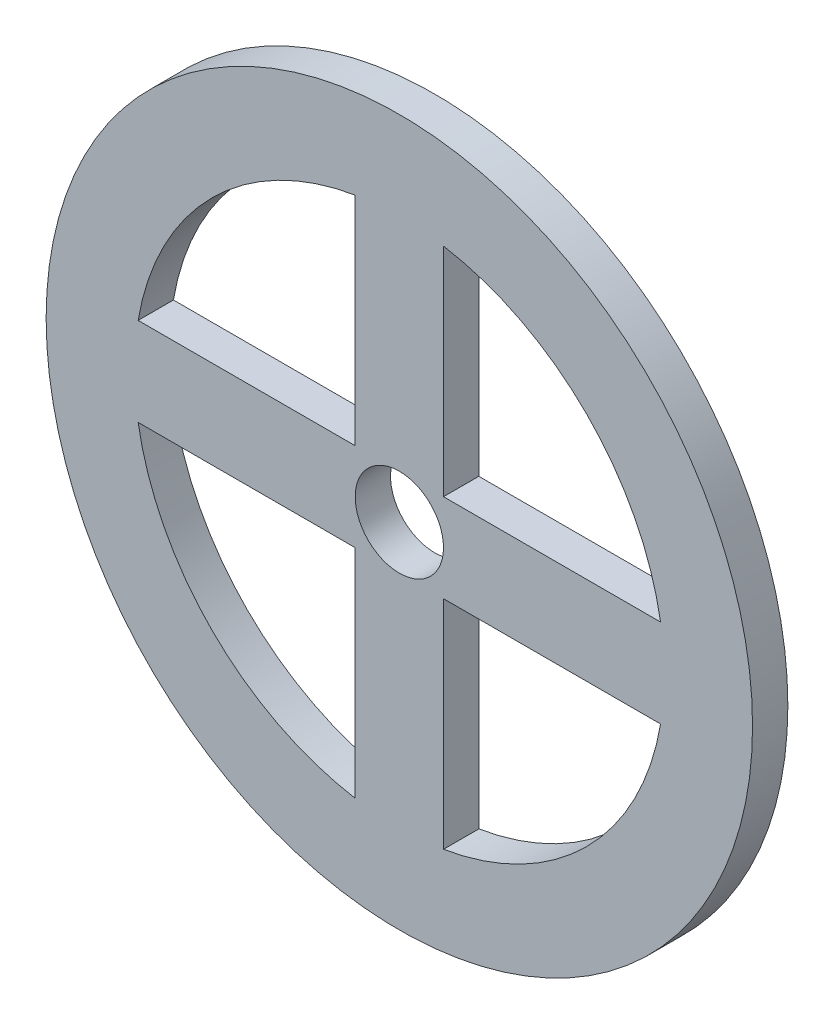
ISO-10303-21;
HEADER;
FILE_DESCRIPTION(('STEP AP214'),'2;1');
FILE_NAME('part.step','',(''),(''),'','','');
FILE_SCHEMA(('AUTOMOTIVE_DESIGN { 1 0 10303 214 1 1 1 1 }'));
ENDSEC;
DATA;
#1=APPLICATION_CONTEXT('core data for automotive mechanical design processes');
#2=APPLICATION_PROTOCOL_DEFINITION('international standard','automotive_design',2000,#1);
#3=PRODUCT_CONTEXT('',#1,'mechanical');
#4=PRODUCT('Part','Part','',(#3));
#5=PRODUCT_RELATED_PRODUCT_CATEGORY('part','',(#4));
#6=PRODUCT_DEFINITION_FORMATION('','',#4);
#7=PRODUCT_DEFINITION_CONTEXT('part definition',#1,'design');
#8=PRODUCT_DEFINITION('design','',#6,#7);
#9=PRODUCT_DEFINITION_SHAPE('','',#8);
#10=(LENGTH_UNIT() NAMED_UNIT(*) SI_UNIT(.MILLI.,.METRE.));
#11=(NAMED_UNIT(*) PLANE_ANGLE_UNIT() SI_UNIT($,.RADIAN.));
#12=(NAMED_UNIT(*) SI_UNIT($,.STERADIAN.) SOLID_ANGLE_UNIT());
#13=UNCERTAINTY_MEASURE_WITH_UNIT(LENGTH_MEASURE(1.E-05),#10,'distance_accuracy_value','');
#14=(GEOMETRIC_REPRESENTATION_CONTEXT(3) GLOBAL_UNCERTAINTY_ASSIGNED_CONTEXT((#13)) GLOBAL_UNIT_ASSIGNED_CONTEXT((#10,
#11,#12)) REPRESENTATION_CONTEXT('',''));
#15=CARTESIAN_POINT('',(0.,0.,0.));
#16=DIRECTION('',(0.,0.,1.));
#17=DIRECTION('',(1.,0.,0.));
#18=AXIS2_PLACEMENT_3D('',#15,#16,#17);
#19=CARTESIAN_POINT('',(0.,0.,2.54));
#20=DIRECTION('',(0.,0.,1.));
#21=DIRECTION('',(1.,0.,0.));
#22=AXIS2_PLACEMENT_3D('',#19,#20,#21);
#23=PLANE('',#22);
#24=CARTESIAN_POINT('',(0.,0.,2.54));
#25=DIRECTION('',(0.,0.,1.));
#26=DIRECTION('',(1.,0.,0.));
#27=AXIS2_PLACEMENT_3D('',#24,#25,#26);
#28=CIRCLE('',#27,19.05);
#29=CARTESIAN_POINT('',(3.175,-18.7835533113413,2.54));
#30=VERTEX_POINT('',#29);
#31=CARTESIAN_POINT('',(18.7835533113413,-3.175,2.54));
#32=VERTEX_POINT('',#31);
#33=EDGE_CURVE('E138',#30,#32,#28,.T.);
#34=ORIENTED_EDGE('',*,*,#33,.F.);
#35=DIRECTION('',(0.,-1.,0.));
#36=VECTOR('',#35,1.);
#37=CARTESIAN_POINT('',(3.175,0.,2.54));
#38=LINE('',#37,#36);
#39=CARTESIAN_POINT('',(3.175,-3.175,2.54));
#40=VERTEX_POINT('',#39);
#41=EDGE_CURVE('E153',#40,#30,#38,.T.);
#42=ORIENTED_EDGE('',*,*,#41,.F.);
#43=DIRECTION('',(1.,0.,0.));
#44=VECTOR('',#43,1.);
#45=CARTESIAN_POINT('',(0.,-3.175,2.54));
#46=LINE('',#45,#44);
#47=EDGE_CURVE('E165',#40,#32,#46,.T.);
#48=ORIENTED_EDGE('',*,*,#47,.T.);
#49=EDGE_LOOP('',(#34,#42,#48));
#50=FACE_BOUND('',#49,.T.);
#51=CARTESIAN_POINT('',(0.,0.,2.54));
#52=DIRECTION('',(0.,0.,1.));
#53=DIRECTION('',(1.,0.,0.));
#54=AXIS2_PLACEMENT_3D('',#51,#52,#53);
#55=CIRCLE('',#54,19.05);
#56=CARTESIAN_POINT('',(-18.7835533113413,-3.175,2.54));
#57=VERTEX_POINT('',#56);
#58=CARTESIAN_POINT('',(-3.175,-18.7835533113413,2.54));
#59=VERTEX_POINT('',#58);
#60=EDGE_CURVE('E237',#57,#59,#55,.T.);
#61=ORIENTED_EDGE('',*,*,#60,.F.);
#62=DIRECTION('',(-1.,0.,0.));
#63=VECTOR('',#62,1.);
#64=CARTESIAN_POINT('',(0.,-3.175,2.54));
#65=LINE('',#64,#63);
#66=CARTESIAN_POINT('',(-3.175,-3.175,2.54));
#67=VERTEX_POINT('',#66);
#68=EDGE_CURVE('E234',#67,#57,#65,.T.);
#69=ORIENTED_EDGE('',*,*,#68,.F.);
#70=DIRECTION('',(0.,-1.,0.));
#71=VECTOR('',#70,1.);
#72=CARTESIAN_POINT('',(-3.175,0.,2.54));
#73=LINE('',#72,#71);
#74=EDGE_CURVE('E242',#67,#59,#73,.T.);
#75=ORIENTED_EDGE('',*,*,#74,.T.);
#76=EDGE_LOOP('',(#61,#69,#75));
#77=FACE_BOUND('',#76,.T.);
#78=CARTESIAN_POINT('',(0.,0.,2.54));
#79=DIRECTION('',(0.,0.,1.));
#80=DIRECTION('',(1.,0.,0.));
#81=AXIS2_PLACEMENT_3D('',#78,#79,#80);
#82=CIRCLE('',#81,25.4);
#83=CARTESIAN_POINT('',(25.4,0.,2.54));
#84=VERTEX_POINT('',#83);
#85=EDGE_CURVE('E11',#84,#84,#82,.T.);
#86=ORIENTED_EDGE('',*,*,#85,.T.);
#87=EDGE_LOOP('',(#86));
#88=FACE_BOUND('',#87,.T.);
#89=CARTESIAN_POINT('',(0.,0.,2.54));
#90=DIRECTION('',(0.,0.,1.));
#91=DIRECTION('',(1.,0.,0.));
#92=AXIS2_PLACEMENT_3D('',#89,#90,#91);
#93=CIRCLE('',#92,3.175);
#94=CARTESIAN_POINT('',(3.175,0.,2.54));
#95=VERTEX_POINT('',#94);
#96=EDGE_CURVE('E333',#95,#95,#93,.T.);
#97=ORIENTED_EDGE('',*,*,#96,.F.);
#98=EDGE_LOOP('',(#97));
#99=FACE_BOUND('',#98,.T.);
#100=CARTESIAN_POINT('',(0.,0.,2.54));
#101=DIRECTION('',(0.,0.,1.));
#102=DIRECTION('',(1.,0.,0.));
#103=AXIS2_PLACEMENT_3D('',#100,#101,#102);
#104=CIRCLE('',#103,19.05);
#105=CARTESIAN_POINT('',(18.7835533113413,3.175,2.54));
#106=VERTEX_POINT('',#105);
#107=CARTESIAN_POINT('',(3.175,18.7835533113413,2.54));
#108=VERTEX_POINT('',#107);
#109=EDGE_CURVE('E229',#106,#108,#104,.T.);
#110=ORIENTED_EDGE('',*,*,#109,.F.);
#111=DIRECTION('',(1.,0.,0.));
#112=VECTOR('',#111,1.);
#113=CARTESIAN_POINT('',(0.,3.175,2.54));
#114=LINE('',#113,#112);
#115=CARTESIAN_POINT('',(3.175,3.175,2.54));
#116=VERTEX_POINT('',#115);
#117=EDGE_CURVE('E219',#116,#106,#114,.T.);
#118=ORIENTED_EDGE('',*,*,#117,.F.);
#119=DIRECTION('',(0.,1.,0.));
#120=VECTOR('',#119,1.);
#121=CARTESIAN_POINT('',(3.175,0.,2.54));
#122=LINE('',#121,#120);
#123=EDGE_CURVE('E214',#116,#108,#122,.T.);
#124=ORIENTED_EDGE('',*,*,#123,.T.);
#125=EDGE_LOOP('',(#110,#118,#124));
#126=FACE_BOUND('',#125,.T.);
#127=CARTESIAN_POINT('',(0.,0.,2.54));
#128=DIRECTION('',(0.,0.,1.));
#129=DIRECTION('',(1.,0.,0.));
#130=AXIS2_PLACEMENT_3D('',#127,#128,#129);
#131=CIRCLE('',#130,19.05);
#132=CARTESIAN_POINT('',(-3.175,18.7835533113413,2.54));
#133=VERTEX_POINT('',#132);
#134=CARTESIAN_POINT('',(-18.7835533113413,3.175,2.54));
#135=VERTEX_POINT('',#134);
#136=EDGE_CURVE('E200',#133,#135,#131,.T.);
#137=ORIENTED_EDGE('',*,*,#136,.F.);
#138=DIRECTION('',(0.,1.,0.));
#139=VECTOR('',#138,1.);
#140=CARTESIAN_POINT('',(-3.175,0.,2.54));
#141=LINE('',#140,#139);
#142=CARTESIAN_POINT('',(-3.175,3.175,2.54));
#143=VERTEX_POINT('',#142);
#144=EDGE_CURVE('E188',#143,#133,#141,.T.);
#145=ORIENTED_EDGE('',*,*,#144,.F.);
#146=DIRECTION('',(-1.,0.,0.));
#147=VECTOR('',#146,1.);
#148=CARTESIAN_POINT('',(0.,3.175,2.54));
#149=LINE('',#148,#147);
#150=EDGE_CURVE('E183',#143,#135,#149,.T.);
#151=ORIENTED_EDGE('',*,*,#150,.T.);
#152=EDGE_LOOP('',(#137,#145,#151));
#153=FACE_BOUND('',#152,.T.);
#154=ADVANCED_FACE('F39',(#50,#77,#88,#99,#126,#153),#23,.T.);
#155=CARTESIAN_POINT('',(0.,0.,0.));
#156=DIRECTION('',(0.,0.,1.));
#157=DIRECTION('',(1.,0.,0.));
#158=AXIS2_PLACEMENT_3D('',#155,#156,#157);
#159=PLANE('',#158);
#160=DIRECTION('',(1.,0.,0.));
#161=VECTOR('',#160,1.);
#162=CARTESIAN_POINT('',(0.,3.175,0.));
#163=LINE('',#162,#161);
#164=CARTESIAN_POINT('',(3.175,3.175,0.));
#165=VERTEX_POINT('',#164);
#166=CARTESIAN_POINT('',(18.7835533113413,3.175,0.));
#167=VERTEX_POINT('',#166);
#168=EDGE_CURVE('E176',#165,#167,#163,.T.);
#169=ORIENTED_EDGE('',*,*,#168,.T.);
#170=CARTESIAN_POINT('',(0.,0.,0.));
#171=DIRECTION('',(0.,0.,1.));
#172=DIRECTION('',(1.,0.,0.));
#173=AXIS2_PLACEMENT_3D('',#170,#171,#172);
#174=CIRCLE('',#173,19.05);
#175=CARTESIAN_POINT('',(3.175,18.7835533113413,0.));
#176=VERTEX_POINT('',#175);
#177=EDGE_CURVE('E218',#167,#176,#174,.T.);
#178=ORIENTED_EDGE('',*,*,#177,.T.);
#179=DIRECTION('',(0.,1.,0.));
#180=VECTOR('',#179,1.);
#181=CARTESIAN_POINT('',(3.175,0.,0.));
#182=LINE('',#181,#180);
#183=EDGE_CURVE('E215',#165,#176,#182,.T.);
#184=ORIENTED_EDGE('',*,*,#183,.F.);
#185=EDGE_LOOP('',(#169,#178,#184));
#186=FACE_BOUND('',#185,.T.);
#187=DIRECTION('',(-1.,0.,0.));
#188=VECTOR('',#187,1.);
#189=CARTESIAN_POINT('',(0.,-3.175,0.));
#190=LINE('',#189,#188);
#191=CARTESIAN_POINT('',(-3.175,-3.175,0.));
#192=VERTEX_POINT('',#191);
#193=CARTESIAN_POINT('',(-18.7835533113413,-3.175,0.));
#194=VERTEX_POINT('',#193);
#195=EDGE_CURVE('E196',#192,#194,#190,.T.);
#196=ORIENTED_EDGE('',*,*,#195,.T.);
#197=CARTESIAN_POINT('',(0.,0.,0.));
#198=DIRECTION('',(0.,0.,1.));
#199=DIRECTION('',(1.,0.,0.));
#200=AXIS2_PLACEMENT_3D('',#197,#198,#199);
#201=CIRCLE('',#200,19.05);
#202=CARTESIAN_POINT('',(-3.175,-18.7835533113413,0.));
#203=VERTEX_POINT('',#202);
#204=EDGE_CURVE('E250',#194,#203,#201,.T.);
#205=ORIENTED_EDGE('',*,*,#204,.T.);
#206=DIRECTION('',(0.,-1.,0.));
#207=VECTOR('',#206,1.);
#208=CARTESIAN_POINT('',(-3.175,0.,0.));
#209=LINE('',#208,#207);
#210=EDGE_CURVE('E238',#192,#203,#209,.T.);
#211=ORIENTED_EDGE('',*,*,#210,.F.);
#212=EDGE_LOOP('',(#196,#205,#211));
#213=FACE_BOUND('',#212,.T.);
#214=CARTESIAN_POINT('',(0.,0.,0.));
#215=DIRECTION('',(0.,0.,1.));
#216=DIRECTION('',(1.,0.,0.));
#217=AXIS2_PLACEMENT_3D('',#214,#215,#216);
#218=CIRCLE('',#217,25.4);
#219=CARTESIAN_POINT('',(25.4,0.,0.));
#220=VERTEX_POINT('',#219);
#221=EDGE_CURVE('E43',#220,#220,#218,.T.);
#222=ORIENTED_EDGE('',*,*,#221,.F.);
#223=EDGE_LOOP('',(#222));
#224=FACE_BOUND('',#223,.T.);
#225=DIRECTION('',(0.,-1.,0.));
#226=VECTOR('',#225,1.);
#227=CARTESIAN_POINT('',(3.175,0.,0.));
#228=LINE('',#227,#226);
#229=CARTESIAN_POINT('',(3.175,-3.175,0.));
#230=VERTEX_POINT('',#229);
#231=CARTESIAN_POINT('',(3.175,-18.7835533113413,0.));
#232=VERTEX_POINT('',#231);
#233=EDGE_CURVE('E157',#230,#232,#228,.T.);
#234=ORIENTED_EDGE('',*,*,#233,.T.);
#235=CARTESIAN_POINT('',(0.,0.,0.));
#236=DIRECTION('',(0.,0.,1.));
#237=DIRECTION('',(1.,0.,0.));
#238=AXIS2_PLACEMENT_3D('',#235,#236,#237);
#239=CIRCLE('',#238,19.05);
#240=CARTESIAN_POINT('',(18.7835533113413,-3.175,0.));
#241=VERTEX_POINT('',#240);
#242=EDGE_CURVE('E135',#232,#241,#239,.T.);
#243=ORIENTED_EDGE('',*,*,#242,.T.);
#244=DIRECTION('',(1.,0.,0.));
#245=VECTOR('',#244,1.);
#246=CARTESIAN_POINT('',(0.,-3.175,0.));
#247=LINE('',#246,#245);
#248=EDGE_CURVE('E148',#230,#241,#247,.T.);
#249=ORIENTED_EDGE('',*,*,#248,.F.);
#250=EDGE_LOOP('',(#234,#243,#249));
#251=FACE_BOUND('',#250,.T.);
#252=CARTESIAN_POINT('',(0.,0.,0.));
#253=DIRECTION('',(0.,0.,1.));
#254=DIRECTION('',(1.,0.,0.));
#255=AXIS2_PLACEMENT_3D('',#252,#253,#254);
#256=CIRCLE('',#255,3.175);
#257=CARTESIAN_POINT('',(3.175,0.,0.));
#258=VERTEX_POINT('',#257);
#259=EDGE_CURVE('E336',#258,#258,#256,.T.);
#260=ORIENTED_EDGE('',*,*,#259,.T.);
#261=EDGE_LOOP('',(#260));
#262=FACE_BOUND('',#261,.T.);
#263=DIRECTION('',(0.,1.,0.));
#264=VECTOR('',#263,1.);
#265=CARTESIAN_POINT('',(-3.175,0.,0.));
#266=LINE('',#265,#264);
#267=CARTESIAN_POINT('',(-3.175,3.175,0.));
#268=VERTEX_POINT('',#267);
#269=CARTESIAN_POINT('',(-3.175,18.7835533113413,0.));
#270=VERTEX_POINT('',#269);
#271=EDGE_CURVE('E192',#268,#270,#266,.T.);
#272=ORIENTED_EDGE('',*,*,#271,.T.);
#273=CARTESIAN_POINT('',(0.,0.,0.));
#274=DIRECTION('',(0.,0.,1.));
#275=DIRECTION('',(1.,0.,0.));
#276=AXIS2_PLACEMENT_3D('',#273,#274,#275);
#277=CIRCLE('',#276,19.05);
#278=CARTESIAN_POINT('',(-18.7835533113413,3.175,0.));
#279=VERTEX_POINT('',#278);
#280=EDGE_CURVE('E187',#270,#279,#277,.T.);
#281=ORIENTED_EDGE('',*,*,#280,.T.);
#282=DIRECTION('',(-1.,0.,0.));
#283=VECTOR('',#282,1.);
#284=CARTESIAN_POINT('',(0.,3.175,0.));
#285=LINE('',#284,#283);
#286=EDGE_CURVE('E184',#268,#279,#285,.T.);
#287=ORIENTED_EDGE('',*,*,#286,.F.);
#288=EDGE_LOOP('',(#272,#281,#287));
#289=FACE_BOUND('',#288,.T.);
#290=ADVANCED_FACE('F155',(#186,#213,#224,#251,#262,#289),#159,.F.);
#291=CARTESIAN_POINT('',(0.,0.,2.54));
#292=DIRECTION('',(0.,0.,-1.));
#293=DIRECTION('',(-1.,0.,0.));
#294=AXIS2_PLACEMENT_3D('',#291,#292,#293);
#295=CYLINDRICAL_SURFACE('',#294,25.4);
#296=ORIENTED_EDGE('',*,*,#85,.F.);
#297=EDGE_LOOP('',(#296));
#298=FACE_BOUND('',#297,.T.);
#299=ORIENTED_EDGE('',*,*,#221,.T.);
#300=EDGE_LOOP('',(#299));
#301=FACE_BOUND('',#300,.T.);
#302=ADVANCED_FACE('F41',(#298,#301),#295,.T.);
#303=CARTESIAN_POINT('',(0.,-3.175,2.54));
#304=DIRECTION('',(0.,-1.,0.));
#305=DIRECTION('',(1.,0.,0.));
#306=AXIS2_PLACEMENT_3D('',#303,#304,#305);
#307=PLANE('',#306);
#308=ORIENTED_EDGE('',*,*,#195,.F.);
#309=DIRECTION('',(0.,0.,-1.));
#310=VECTOR('',#309,1.);
#311=CARTESIAN_POINT('',(-3.175,-3.175,2.54));
#312=LINE('',#311,#310);
#313=EDGE_CURVE('E246',#67,#192,#312,.T.);
#314=ORIENTED_EDGE('',*,*,#313,.F.);
#315=ORIENTED_EDGE('',*,*,#68,.T.);
#316=DIRECTION('',(0.,0.,-1.));
#317=VECTOR('',#316,1.);
#318=CARTESIAN_POINT('',(-18.7835533113413,-3.175,2.54));
#319=LINE('',#318,#317);
#320=EDGE_CURVE('E263',#57,#194,#319,.T.);
#321=ORIENTED_EDGE('',*,*,#320,.T.);
#322=EDGE_LOOP('',(#308,#314,#315,#321));
#323=FACE_BOUND('',#322,.T.);
#324=ADVANCED_FACE('F279',(#323),#307,.T.);
#325=CARTESIAN_POINT('',(0.,0.,2.54));
#326=DIRECTION('',(0.,0.,-1.));
#327=DIRECTION('',(-1.,0.,0.));
#328=AXIS2_PLACEMENT_3D('',#325,#326,#327);
#329=CYLINDRICAL_SURFACE('',#328,19.05);
#330=ORIENTED_EDGE('',*,*,#204,.F.);
#331=ORIENTED_EDGE('',*,*,#320,.F.);
#332=ORIENTED_EDGE('',*,*,#60,.T.);
#333=DIRECTION('',(0.,0.,-1.));
#334=VECTOR('',#333,1.);
#335=CARTESIAN_POINT('',(-3.175,-18.7835533113413,2.54));
#336=LINE('',#335,#334);
#337=EDGE_CURVE('E260',#59,#203,#336,.T.);
#338=ORIENTED_EDGE('',*,*,#337,.T.);
#339=EDGE_LOOP('',(#330,#331,#332,#338));
#340=FACE_BOUND('',#339,.T.);
#341=ADVANCED_FACE('F287',(#340),#329,.F.);
#342=CARTESIAN_POINT('',(-3.175,0.,2.54));
#343=DIRECTION('',(1.,0.,0.));
#344=DIRECTION('',(0.,1.,0.));
#345=AXIS2_PLACEMENT_3D('',#342,#343,#344);
#346=PLANE('',#345);
#347=ORIENTED_EDGE('',*,*,#210,.T.);
#348=ORIENTED_EDGE('',*,*,#337,.F.);
#349=ORIENTED_EDGE('',*,*,#74,.F.);
#350=ORIENTED_EDGE('',*,*,#313,.T.);
#351=EDGE_LOOP('',(#347,#348,#349,#350));
#352=FACE_BOUND('',#351,.T.);
#353=ADVANCED_FACE('F290',(#352),#346,.F.);
#354=CARTESIAN_POINT('',(3.175,0.,2.54));
#355=DIRECTION('',(1.,0.,0.));
#356=DIRECTION('',(0.,1.,0.));
#357=AXIS2_PLACEMENT_3D('',#354,#355,#356);
#358=PLANE('',#357);
#359=ORIENTED_EDGE('',*,*,#233,.F.);
#360=DIRECTION('',(0.,0.,-1.));
#361=VECTOR('',#360,1.);
#362=CARTESIAN_POINT('',(3.175,-3.175,2.54));
#363=LINE('',#362,#361);
#364=EDGE_CURVE('E143',#40,#230,#363,.T.);
#365=ORIENTED_EDGE('',*,*,#364,.F.);
#366=ORIENTED_EDGE('',*,*,#41,.T.);
#367=DIRECTION('',(0.,0.,-1.));
#368=VECTOR('',#367,1.);
#369=CARTESIAN_POINT('',(3.175,-18.7835533113413,2.54));
#370=LINE('',#369,#368);
#371=EDGE_CURVE('E144',#30,#232,#370,.T.);
#372=ORIENTED_EDGE('',*,*,#371,.T.);
#373=EDGE_LOOP('',(#359,#365,#366,#372));
#374=FACE_BOUND('',#373,.T.);
#375=ADVANCED_FACE('F294',(#374),#358,.T.);
#376=CARTESIAN_POINT('',(0.,0.,2.54));
#377=DIRECTION('',(0.,0.,-1.));
#378=DIRECTION('',(-1.,0.,0.));
#379=AXIS2_PLACEMENT_3D('',#376,#377,#378);
#380=CYLINDRICAL_SURFACE('',#379,19.05);
#381=ORIENTED_EDGE('',*,*,#242,.F.);
#382=ORIENTED_EDGE('',*,*,#371,.F.);
#383=ORIENTED_EDGE('',*,*,#33,.T.);
#384=DIRECTION('',(0.,0.,-1.));
#385=VECTOR('',#384,1.);
#386=CARTESIAN_POINT('',(18.7835533113413,-3.175,2.54));
#387=LINE('',#386,#385);
#388=EDGE_CURVE('E130',#32,#241,#387,.T.);
#389=ORIENTED_EDGE('',*,*,#388,.T.);
#390=EDGE_LOOP('',(#381,#382,#383,#389));
#391=FACE_BOUND('',#390,.T.);
#392=ADVANCED_FACE('F132',(#391),#380,.F.);
#393=CARTESIAN_POINT('',(0.,-3.175,2.54));
#394=DIRECTION('',(0.,1.,0.));
#395=DIRECTION('',(-1.,0.,0.));
#396=AXIS2_PLACEMENT_3D('',#393,#394,#395);
#397=PLANE('',#396);
#398=ORIENTED_EDGE('',*,*,#248,.T.);
#399=ORIENTED_EDGE('',*,*,#388,.F.);
#400=ORIENTED_EDGE('',*,*,#47,.F.);
#401=ORIENTED_EDGE('',*,*,#364,.T.);
#402=EDGE_LOOP('',(#398,#399,#400,#401));
#403=FACE_BOUND('',#402,.T.);
#404=ADVANCED_FACE('F149',(#403),#397,.F.);
#405=CARTESIAN_POINT('',(0.,0.,2.54));
#406=DIRECTION('',(0.,0.,-1.));
#407=DIRECTION('',(-1.,0.,0.));
#408=AXIS2_PLACEMENT_3D('',#405,#406,#407);
#409=CYLINDRICAL_SURFACE('',#408,3.175);
#410=ORIENTED_EDGE('',*,*,#96,.T.);
#411=EDGE_LOOP('',(#410));
#412=FACE_BOUND('',#411,.T.);
#413=ORIENTED_EDGE('',*,*,#259,.F.);
#414=EDGE_LOOP('',(#413));
#415=FACE_BOUND('',#414,.T.);
#416=ADVANCED_FACE('F307',(#412,#415),#409,.F.);
#417=CARTESIAN_POINT('',(0.,3.175,2.54));
#418=DIRECTION('',(0.,1.,0.));
#419=DIRECTION('',(-1.,0.,0.));
#420=AXIS2_PLACEMENT_3D('',#417,#418,#419);
#421=PLANE('',#420);
#422=ORIENTED_EDGE('',*,*,#168,.F.);
#423=DIRECTION('',(0.,0.,-1.));
#424=VECTOR('',#423,1.);
#425=CARTESIAN_POINT('',(3.175,3.175,2.54));
#426=LINE('',#425,#424);
#427=EDGE_CURVE('E210',#116,#165,#426,.T.);
#428=ORIENTED_EDGE('',*,*,#427,.F.);
#429=ORIENTED_EDGE('',*,*,#117,.T.);
#430=DIRECTION('',(0.,0.,-1.));
#431=VECTOR('',#430,1.);
#432=CARTESIAN_POINT('',(18.7835533113413,3.175,2.54));
#433=LINE('',#432,#431);
#434=EDGE_CURVE('E161',#106,#167,#433,.T.);
#435=ORIENTED_EDGE('',*,*,#434,.T.);
#436=EDGE_LOOP('',(#422,#428,#429,#435));
#437=FACE_BOUND('',#436,.T.);
#438=ADVANCED_FACE('F303',(#437),#421,.T.);
#439=CARTESIAN_POINT('',(0.,0.,2.54));
#440=DIRECTION('',(0.,0.,-1.));
#441=DIRECTION('',(-1.,0.,0.));
#442=AXIS2_PLACEMENT_3D('',#439,#440,#441);
#443=CYLINDRICAL_SURFACE('',#442,19.05);
#444=ORIENTED_EDGE('',*,*,#177,.F.);
#445=ORIENTED_EDGE('',*,*,#434,.F.);
#446=ORIENTED_EDGE('',*,*,#109,.T.);
#447=DIRECTION('',(0.,0.,-1.));
#448=VECTOR('',#447,1.);
#449=CARTESIAN_POINT('',(3.175,18.7835533113413,2.54));
#450=LINE('',#449,#448);
#451=EDGE_CURVE('E63',#108,#176,#450,.T.);
#452=ORIENTED_EDGE('',*,*,#451,.T.);
#453=EDGE_LOOP('',(#444,#445,#446,#452));
#454=FACE_BOUND('',#453,.T.);
#455=ADVANCED_FACE('F300',(#454),#443,.F.);
#456=CARTESIAN_POINT('',(3.175,0.,2.54));
#457=DIRECTION('',(-1.,0.,0.));
#458=DIRECTION('',(0.,-1.,0.));
#459=AXIS2_PLACEMENT_3D('',#456,#457,#458);
#460=PLANE('',#459);
#461=ORIENTED_EDGE('',*,*,#183,.T.);
#462=ORIENTED_EDGE('',*,*,#451,.F.);
#463=ORIENTED_EDGE('',*,*,#123,.F.);
#464=ORIENTED_EDGE('',*,*,#427,.T.);
#465=EDGE_LOOP('',(#461,#462,#463,#464));
#466=FACE_BOUND('',#465,.T.);
#467=ADVANCED_FACE('F296',(#466),#460,.F.);
#468=CARTESIAN_POINT('',(-3.175,0.,2.54));
#469=DIRECTION('',(-1.,0.,0.));
#470=DIRECTION('',(0.,-1.,0.));
#471=AXIS2_PLACEMENT_3D('',#468,#469,#470);
#472=PLANE('',#471);
#473=ORIENTED_EDGE('',*,*,#271,.F.);
#474=DIRECTION('',(0.,0.,-1.));
#475=VECTOR('',#474,1.);
#476=CARTESIAN_POINT('',(-3.175,3.175,2.54));
#477=LINE('',#476,#475);
#478=EDGE_CURVE('E179',#143,#268,#477,.T.);
#479=ORIENTED_EDGE('',*,*,#478,.F.);
#480=ORIENTED_EDGE('',*,*,#144,.T.);
#481=DIRECTION('',(0.,0.,-1.));
#482=VECTOR('',#481,1.);
#483=CARTESIAN_POINT('',(-3.175,18.7835533113413,2.54));
#484=LINE('',#483,#482);
#485=EDGE_CURVE('E172',#133,#270,#484,.T.);
#486=ORIENTED_EDGE('',*,*,#485,.T.);
#487=EDGE_LOOP('',(#473,#479,#480,#486));
#488=FACE_BOUND('',#487,.T.);
#489=ADVANCED_FACE('F299',(#488),#472,.T.);
#490=CARTESIAN_POINT('',(0.,0.,2.54));
#491=DIRECTION('',(0.,0.,-1.));
#492=DIRECTION('',(-1.,0.,0.));
#493=AXIS2_PLACEMENT_3D('',#490,#491,#492);
#494=CYLINDRICAL_SURFACE('',#493,19.05);
#495=ORIENTED_EDGE('',*,*,#280,.F.);
#496=ORIENTED_EDGE('',*,*,#485,.F.);
#497=ORIENTED_EDGE('',*,*,#136,.T.);
#498=DIRECTION('',(0.,0.,-1.));
#499=VECTOR('',#498,1.);
#500=CARTESIAN_POINT('',(-18.7835533113413,3.175,2.54));
#501=LINE('',#500,#499);
#502=EDGE_CURVE('E55',#135,#279,#501,.T.);
#503=ORIENTED_EDGE('',*,*,#502,.T.);
#504=EDGE_LOOP('',(#495,#496,#497,#503));
#505=FACE_BOUND('',#504,.T.);
#506=ADVANCED_FACE('F312',(#505),#494,.F.);
#507=CARTESIAN_POINT('',(0.,3.175,2.54));
#508=DIRECTION('',(0.,-1.,0.));
#509=DIRECTION('',(1.,0.,0.));
#510=AXIS2_PLACEMENT_3D('',#507,#508,#509);
#511=PLANE('',#510);
#512=ORIENTED_EDGE('',*,*,#286,.T.);
#513=ORIENTED_EDGE('',*,*,#502,.F.);
#514=ORIENTED_EDGE('',*,*,#150,.F.);
#515=ORIENTED_EDGE('',*,*,#478,.T.);
#516=EDGE_LOOP('',(#512,#513,#514,#515));
#517=FACE_BOUND('',#516,.T.);
#518=ADVANCED_FACE('F309',(#517),#511,.F.);
#519=CLOSED_SHELL('',(#154,#290,#302,#324,#341,#353,#375,#392,#404,#416,#438,#455,#467,#489,
#506,#518));
#520=MANIFOLD_SOLID_BREP('B2',#519);
#521=ADVANCED_BREP_SHAPE_REPRESENTATION('',(#18,#520),#14);
#522=SHAPE_DEFINITION_REPRESENTATION(#9,#521);
ENDSEC;
END-ISO-10303-21;
